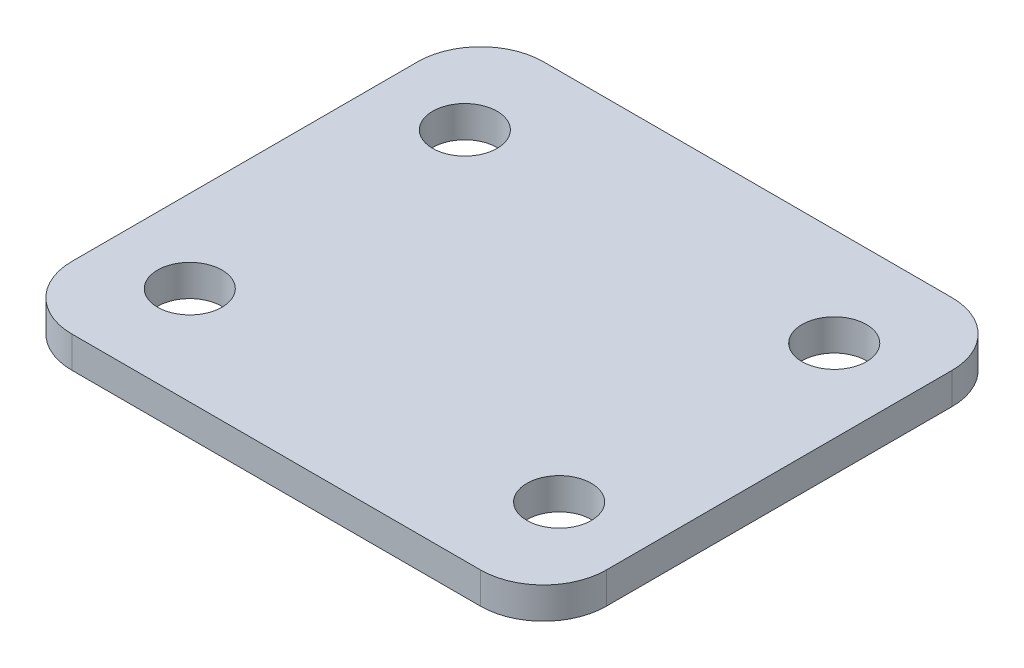
ISO-10303-21;
HEADER;
FILE_DESCRIPTION(('STEP AP214'),'2;1');
FILE_NAME('part.step','',(''),(''),'','','');
FILE_SCHEMA(('AUTOMOTIVE_DESIGN { 1 0 10303 214 1 1 1 1 }'));
ENDSEC;
DATA;
#1=APPLICATION_CONTEXT('core data for automotive mechanical design processes');
#2=APPLICATION_PROTOCOL_DEFINITION('international standard','automotive_design',2000,#1);
#3=PRODUCT_CONTEXT('',#1,'mechanical');
#4=PRODUCT('Part','Part','',(#3));
#5=PRODUCT_RELATED_PRODUCT_CATEGORY('part','',(#4));
#6=PRODUCT_DEFINITION_FORMATION('','',#4);
#7=PRODUCT_DEFINITION_CONTEXT('part definition',#1,'design');
#8=PRODUCT_DEFINITION('design','',#6,#7);
#9=PRODUCT_DEFINITION_SHAPE('','',#8);
#10=(LENGTH_UNIT() NAMED_UNIT(*) SI_UNIT(.MILLI.,.METRE.));
#11=(NAMED_UNIT(*) PLANE_ANGLE_UNIT() SI_UNIT($,.RADIAN.));
#12=(NAMED_UNIT(*) SI_UNIT($,.STERADIAN.) SOLID_ANGLE_UNIT());
#13=UNCERTAINTY_MEASURE_WITH_UNIT(LENGTH_MEASURE(1.E-05),#10,'distance_accuracy_value','');
#14=(GEOMETRIC_REPRESENTATION_CONTEXT(3) GLOBAL_UNCERTAINTY_ASSIGNED_CONTEXT((#13)) GLOBAL_UNIT_ASSIGNED_CONTEXT((#10,
#11,#12)) REPRESENTATION_CONTEXT('',''));
#15=CARTESIAN_POINT('',(0.,0.,0.));
#16=DIRECTION('',(0.,0.,1.));
#17=DIRECTION('',(1.,0.,0.));
#18=AXIS2_PLACEMENT_3D('',#15,#16,#17);
#19=CARTESIAN_POINT('',(0.,2.,0.));
#20=DIRECTION('',(0.,1.,0.));
#21=DIRECTION('',(0.,0.,1.));
#22=AXIS2_PLACEMENT_3D('',#19,#20,#21);
#23=PLANE('',#22);
#24=CARTESIAN_POINT('',(11.75,2.,8.75));
#25=DIRECTION('',(0.,1.,0.));
#26=DIRECTION('',(0.,0.,1.));
#27=AXIS2_PLACEMENT_3D('',#24,#25,#26);
#28=CIRCLE('',#27,2.05);
#29=CARTESIAN_POINT('',(11.75,2.,10.8));
#30=VERTEX_POINT('',#29);
#31=EDGE_CURVE('E192',#30,#30,#28,.T.);
#32=ORIENTED_EDGE('',*,*,#31,.F.);
#33=EDGE_LOOP('',(#32));
#34=FACE_BOUND('',#33,.T.);
#35=CARTESIAN_POINT('',(-11.75,2.,-8.75));
#36=DIRECTION('',(0.,1.,0.));
#37=DIRECTION('',(0.,0.,1.));
#38=AXIS2_PLACEMENT_3D('',#35,#36,#37);
#39=CIRCLE('',#38,2.05);
#40=CARTESIAN_POINT('',(-11.75,2.,-6.7));
#41=VERTEX_POINT('',#40);
#42=EDGE_CURVE('E182',#41,#41,#39,.T.);
#43=ORIENTED_EDGE('',*,*,#42,.F.);
#44=EDGE_LOOP('',(#43));
#45=FACE_BOUND('',#44,.T.);
#46=DIRECTION('',(-1.,0.,0.));
#47=VECTOR('',#46,1.);
#48=CARTESIAN_POINT('',(-17.,2.,-15.));
#49=LINE('',#48,#47);
#50=CARTESIAN_POINT('',(13.,2.,-15.));
#51=VERTEX_POINT('',#50);
#52=CARTESIAN_POINT('',(-13.,2.,-15.));
#53=VERTEX_POINT('',#52);
#54=EDGE_CURVE('E173',#51,#53,#49,.T.);
#55=ORIENTED_EDGE('',*,*,#54,.T.);
#56=CARTESIAN_POINT('',(-13.,2.,-11.));
#57=DIRECTION('',(0.,1.,0.));
#58=DIRECTION('',(0.,0.,1.));
#59=AXIS2_PLACEMENT_3D('',#56,#57,#58);
#60=CIRCLE('',#59,4.);
#61=CARTESIAN_POINT('',(-17.,2.,-11.));
#62=VERTEX_POINT('',#61);
#63=EDGE_CURVE('E151',#53,#62,#60,.T.);
#64=ORIENTED_EDGE('',*,*,#63,.T.);
#65=DIRECTION('',(0.,0.,1.));
#66=VECTOR('',#65,1.);
#67=CARTESIAN_POINT('',(-17.,2.,-15.));
#68=LINE('',#67,#66);
#69=CARTESIAN_POINT('',(-17.,2.,11.));
#70=VERTEX_POINT('',#69);
#71=EDGE_CURVE('E121',#62,#70,#68,.T.);
#72=ORIENTED_EDGE('',*,*,#71,.T.);
#73=CARTESIAN_POINT('',(-13.,2.,11.));
#74=DIRECTION('',(0.,1.,0.));
#75=DIRECTION('',(0.,0.,1.));
#76=AXIS2_PLACEMENT_3D('',#73,#74,#75);
#77=CIRCLE('',#76,4.);
#78=CARTESIAN_POINT('',(-13.,2.,15.));
#79=VERTEX_POINT('',#78);
#80=EDGE_CURVE('E57',#70,#79,#77,.T.);
#81=ORIENTED_EDGE('',*,*,#80,.T.);
#82=DIRECTION('',(1.,0.,0.));
#83=VECTOR('',#82,1.);
#84=CARTESIAN_POINT('',(-17.,2.,15.));
#85=LINE('',#84,#83);
#86=CARTESIAN_POINT('',(13.,2.,15.));
#87=VERTEX_POINT('',#86);
#88=EDGE_CURVE('E137',#79,#87,#85,.T.);
#89=ORIENTED_EDGE('',*,*,#88,.T.);
#90=CARTESIAN_POINT('',(13.,2.,11.));
#91=DIRECTION('',(0.,1.,0.));
#92=DIRECTION('',(0.,0.,1.));
#93=AXIS2_PLACEMENT_3D('',#90,#91,#92);
#94=CIRCLE('',#93,4.);
#95=CARTESIAN_POINT('',(17.,2.,11.));
#96=VERTEX_POINT('',#95);
#97=EDGE_CURVE('E147',#87,#96,#94,.T.);
#98=ORIENTED_EDGE('',*,*,#97,.T.);
#99=DIRECTION('',(0.,0.,-1.));
#100=VECTOR('',#99,1.);
#101=CARTESIAN_POINT('',(17.,2.,-15.));
#102=LINE('',#101,#100);
#103=CARTESIAN_POINT('',(17.,2.,-11.));
#104=VERTEX_POINT('',#103);
#105=EDGE_CURVE('E131',#96,#104,#102,.T.);
#106=ORIENTED_EDGE('',*,*,#105,.T.);
#107=CARTESIAN_POINT('',(13.,2.,-11.));
#108=DIRECTION('',(0.,1.,0.));
#109=DIRECTION('',(0.,0.,1.));
#110=AXIS2_PLACEMENT_3D('',#107,#108,#109);
#111=CIRCLE('',#110,4.);
#112=EDGE_CURVE('E149',#104,#51,#111,.T.);
#113=ORIENTED_EDGE('',*,*,#112,.T.);
#114=EDGE_LOOP('',(#55,#64,#72,#81,#89,#98,#106,#113));
#115=FACE_BOUND('',#114,.T.);
#116=CARTESIAN_POINT('',(11.75,2.,-8.75));
#117=DIRECTION('',(0.,1.,0.));
#118=DIRECTION('',(0.,0.,1.));
#119=AXIS2_PLACEMENT_3D('',#116,#117,#118);
#120=CIRCLE('',#119,2.05);
#121=CARTESIAN_POINT('',(11.75,2.,-6.7));
#122=VERTEX_POINT('',#121);
#123=EDGE_CURVE('E187',#122,#122,#120,.T.);
#124=ORIENTED_EDGE('',*,*,#123,.F.);
#125=EDGE_LOOP('',(#124));
#126=FACE_BOUND('',#125,.T.);
#127=CARTESIAN_POINT('',(-11.75,2.,8.75));
#128=DIRECTION('',(0.,1.,0.));
#129=DIRECTION('',(0.,0.,1.));
#130=AXIS2_PLACEMENT_3D('',#127,#128,#129);
#131=CIRCLE('',#130,2.05);
#132=CARTESIAN_POINT('',(-11.75,2.,10.8));
#133=VERTEX_POINT('',#132);
#134=EDGE_CURVE('E198',#133,#133,#131,.T.);
#135=ORIENTED_EDGE('',*,*,#134,.F.);
#136=EDGE_LOOP('',(#135));
#137=FACE_BOUND('',#136,.T.);
#138=ADVANCED_FACE('F37',(#34,#45,#115,#126,#137),#23,.T.);
#139=CARTESIAN_POINT('',(0.,0.,0.));
#140=DIRECTION('',(0.,1.,0.));
#141=DIRECTION('',(0.,0.,1.));
#142=AXIS2_PLACEMENT_3D('',#139,#140,#141);
#143=PLANE('',#142);
#144=DIRECTION('',(0.,0.,1.));
#145=VECTOR('',#144,1.);
#146=CARTESIAN_POINT('',(-17.,0.,-15.));
#147=LINE('',#146,#145);
#148=CARTESIAN_POINT('',(-17.,0.,-11.));
#149=VERTEX_POINT('',#148);
#150=CARTESIAN_POINT('',(-17.,0.,11.));
#151=VERTEX_POINT('',#150);
#152=EDGE_CURVE('E119',#149,#151,#147,.T.);
#153=ORIENTED_EDGE('',*,*,#152,.F.);
#154=CARTESIAN_POINT('',(-13.,0.,-11.));
#155=DIRECTION('',(0.,1.,0.));
#156=DIRECTION('',(0.,0.,1.));
#157=AXIS2_PLACEMENT_3D('',#154,#155,#156);
#158=CIRCLE('',#157,4.);
#159=CARTESIAN_POINT('',(-13.,0.,-15.));
#160=VERTEX_POINT('',#159);
#161=EDGE_CURVE('E102',#149,#160,#158,.F.);
#162=ORIENTED_EDGE('',*,*,#161,.T.);
#163=DIRECTION('',(-1.,0.,0.));
#164=VECTOR('',#163,1.);
#165=CARTESIAN_POINT('',(-17.,0.,-15.));
#166=LINE('',#165,#164);
#167=CARTESIAN_POINT('',(13.,0.,-15.));
#168=VERTEX_POINT('',#167);
#169=EDGE_CURVE('E129',#168,#160,#166,.T.);
#170=ORIENTED_EDGE('',*,*,#169,.F.);
#171=CARTESIAN_POINT('',(13.,0.,-11.));
#172=DIRECTION('',(0.,1.,0.));
#173=DIRECTION('',(0.,0.,1.));
#174=AXIS2_PLACEMENT_3D('',#171,#172,#173);
#175=CIRCLE('',#174,4.);
#176=CARTESIAN_POINT('',(17.,0.,-11.));
#177=VERTEX_POINT('',#176);
#178=EDGE_CURVE('E113',#168,#177,#175,.F.);
#179=ORIENTED_EDGE('',*,*,#178,.T.);
#180=DIRECTION('',(0.,0.,-1.));
#181=VECTOR('',#180,1.);
#182=CARTESIAN_POINT('',(17.,0.,-15.));
#183=LINE('',#182,#181);
#184=CARTESIAN_POINT('',(17.,0.,11.));
#185=VERTEX_POINT('',#184);
#186=EDGE_CURVE('E133',#185,#177,#183,.T.);
#187=ORIENTED_EDGE('',*,*,#186,.F.);
#188=CARTESIAN_POINT('',(13.,0.,11.));
#189=DIRECTION('',(0.,1.,0.));
#190=DIRECTION('',(0.,0.,1.));
#191=AXIS2_PLACEMENT_3D('',#188,#189,#190);
#192=CIRCLE('',#191,4.);
#193=CARTESIAN_POINT('',(13.,0.,15.));
#194=VERTEX_POINT('',#193);
#195=EDGE_CURVE('E140',#185,#194,#192,.F.);
#196=ORIENTED_EDGE('',*,*,#195,.T.);
#197=DIRECTION('',(1.,0.,0.));
#198=VECTOR('',#197,1.);
#199=CARTESIAN_POINT('',(-17.,0.,15.));
#200=LINE('',#199,#198);
#201=CARTESIAN_POINT('',(-13.,0.,15.));
#202=VERTEX_POINT('',#201);
#203=EDGE_CURVE('E128',#202,#194,#200,.T.);
#204=ORIENTED_EDGE('',*,*,#203,.F.);
#205=CARTESIAN_POINT('',(-13.,0.,11.));
#206=DIRECTION('',(0.,1.,0.));
#207=DIRECTION('',(0.,0.,1.));
#208=AXIS2_PLACEMENT_3D('',#205,#206,#207);
#209=CIRCLE('',#208,4.);
#210=EDGE_CURVE('E122',#202,#151,#209,.F.);
#211=ORIENTED_EDGE('',*,*,#210,.T.);
#212=EDGE_LOOP('',(#153,#162,#170,#179,#187,#196,#204,#211));
#213=FACE_BOUND('',#212,.T.);
#214=CARTESIAN_POINT('',(-11.75,0.,-8.75));
#215=DIRECTION('',(0.,1.,0.));
#216=DIRECTION('',(0.,0.,1.));
#217=AXIS2_PLACEMENT_3D('',#214,#215,#216);
#218=CIRCLE('',#217,2.05);
#219=CARTESIAN_POINT('',(-11.75,0.,-6.7));
#220=VERTEX_POINT('',#219);
#221=EDGE_CURVE('E178',#220,#220,#218,.T.);
#222=ORIENTED_EDGE('',*,*,#221,.T.);
#223=EDGE_LOOP('',(#222));
#224=FACE_BOUND('',#223,.T.);
#225=CARTESIAN_POINT('',(11.75,0.,-8.75));
#226=DIRECTION('',(0.,1.,0.));
#227=DIRECTION('',(0.,0.,1.));
#228=AXIS2_PLACEMENT_3D('',#225,#226,#227);
#229=CIRCLE('',#228,2.05);
#230=CARTESIAN_POINT('',(11.75,0.,-6.7));
#231=VERTEX_POINT('',#230);
#232=EDGE_CURVE('E189',#231,#231,#229,.T.);
#233=ORIENTED_EDGE('',*,*,#232,.T.);
#234=EDGE_LOOP('',(#233));
#235=FACE_BOUND('',#234,.T.);
#236=CARTESIAN_POINT('',(11.75,0.,8.75));
#237=DIRECTION('',(0.,1.,0.));
#238=DIRECTION('',(0.,0.,1.));
#239=AXIS2_PLACEMENT_3D('',#236,#237,#238);
#240=CIRCLE('',#239,2.05);
#241=CARTESIAN_POINT('',(11.75,0.,10.8));
#242=VERTEX_POINT('',#241);
#243=EDGE_CURVE('E195',#242,#242,#240,.T.);
#244=ORIENTED_EDGE('',*,*,#243,.T.);
#245=EDGE_LOOP('',(#244));
#246=FACE_BOUND('',#245,.T.);
#247=CARTESIAN_POINT('',(-11.75,0.,8.75));
#248=DIRECTION('',(0.,1.,0.));
#249=DIRECTION('',(0.,0.,1.));
#250=AXIS2_PLACEMENT_3D('',#247,#248,#249);
#251=CIRCLE('',#250,2.05);
#252=CARTESIAN_POINT('',(-11.75,0.,10.8));
#253=VERTEX_POINT('',#252);
#254=EDGE_CURVE('E201',#253,#253,#251,.T.);
#255=ORIENTED_EDGE('',*,*,#254,.T.);
#256=EDGE_LOOP('',(#255));
#257=FACE_BOUND('',#256,.T.);
#258=ADVANCED_FACE('F125',(#213,#224,#235,#246,#257),#143,.F.);
#259=CARTESIAN_POINT('',(17.,2.,-15.));
#260=DIRECTION('',(-1.,0.,0.));
#261=DIRECTION('',(0.,0.,1.));
#262=AXIS2_PLACEMENT_3D('',#259,#260,#261);
#263=PLANE('',#262);
#264=ORIENTED_EDGE('',*,*,#186,.T.);
#265=DIRECTION('',(0.,-1.,0.));
#266=VECTOR('',#265,1.);
#267=CARTESIAN_POINT('',(17.,2.,-11.));
#268=LINE('',#267,#266);
#269=EDGE_CURVE('E156',#177,#104,#268,.F.);
#270=ORIENTED_EDGE('',*,*,#269,.T.);
#271=ORIENTED_EDGE('',*,*,#105,.F.);
#272=DIRECTION('',(0.,-1.,0.));
#273=VECTOR('',#272,1.);
#274=CARTESIAN_POINT('',(17.,2.,11.));
#275=LINE('',#274,#273);
#276=EDGE_CURVE('E153',#96,#185,#275,.T.);
#277=ORIENTED_EDGE('',*,*,#276,.T.);
#278=EDGE_LOOP('',(#264,#270,#271,#277));
#279=FACE_BOUND('',#278,.T.);
#280=ADVANCED_FACE('F169',(#279),#263,.F.);
#281=CARTESIAN_POINT('',(-17.,2.,-15.));
#282=DIRECTION('',(0.,0.,1.));
#283=DIRECTION('',(1.,0.,0.));
#284=AXIS2_PLACEMENT_3D('',#281,#282,#283);
#285=PLANE('',#284);
#286=ORIENTED_EDGE('',*,*,#169,.T.);
#287=DIRECTION('',(0.,-1.,0.));
#288=VECTOR('',#287,1.);
#289=CARTESIAN_POINT('',(-13.,2.,-15.));
#290=LINE('',#289,#288);
#291=EDGE_CURVE('E107',#160,#53,#290,.F.);
#292=ORIENTED_EDGE('',*,*,#291,.T.);
#293=ORIENTED_EDGE('',*,*,#54,.F.);
#294=DIRECTION('',(0.,-1.,0.));
#295=VECTOR('',#294,1.);
#296=CARTESIAN_POINT('',(13.,2.,-15.));
#297=LINE('',#296,#295);
#298=EDGE_CURVE('E112',#51,#168,#297,.T.);
#299=ORIENTED_EDGE('',*,*,#298,.T.);
#300=EDGE_LOOP('',(#286,#292,#293,#299));
#301=FACE_BOUND('',#300,.T.);
#302=ADVANCED_FACE('F227',(#301),#285,.F.);
#303=CARTESIAN_POINT('',(-17.,2.,-15.));
#304=DIRECTION('',(1.,0.,0.));
#305=DIRECTION('',(0.,0.,-1.));
#306=AXIS2_PLACEMENT_3D('',#303,#304,#305);
#307=PLANE('',#306);
#308=ORIENTED_EDGE('',*,*,#71,.F.);
#309=DIRECTION('',(0.,-1.,0.));
#310=VECTOR('',#309,1.);
#311=CARTESIAN_POINT('',(-17.,2.,-11.));
#312=LINE('',#311,#310);
#313=EDGE_CURVE('E106',#62,#149,#312,.T.);
#314=ORIENTED_EDGE('',*,*,#313,.T.);
#315=ORIENTED_EDGE('',*,*,#152,.T.);
#316=DIRECTION('',(0.,-1.,0.));
#317=VECTOR('',#316,1.);
#318=CARTESIAN_POINT('',(-17.,2.,11.));
#319=LINE('',#318,#317);
#320=EDGE_CURVE('E123',#151,#70,#319,.F.);
#321=ORIENTED_EDGE('',*,*,#320,.T.);
#322=EDGE_LOOP('',(#308,#314,#315,#321));
#323=FACE_BOUND('',#322,.T.);
#324=ADVANCED_FACE('F118',(#323),#307,.F.);
#325=CARTESIAN_POINT('',(-17.,2.,15.));
#326=DIRECTION('',(0.,0.,-1.));
#327=DIRECTION('',(-1.,0.,0.));
#328=AXIS2_PLACEMENT_3D('',#325,#326,#327);
#329=PLANE('',#328);
#330=ORIENTED_EDGE('',*,*,#203,.T.);
#331=DIRECTION('',(0.,-1.,0.));
#332=VECTOR('',#331,1.);
#333=CARTESIAN_POINT('',(13.,2.,15.));
#334=LINE('',#333,#332);
#335=EDGE_CURVE('E11',#194,#87,#334,.F.);
#336=ORIENTED_EDGE('',*,*,#335,.T.);
#337=ORIENTED_EDGE('',*,*,#88,.F.);
#338=DIRECTION('',(0.,-1.,0.));
#339=VECTOR('',#338,1.);
#340=CARTESIAN_POINT('',(-13.,2.,15.));
#341=LINE('',#340,#339);
#342=EDGE_CURVE('E45',#79,#202,#341,.T.);
#343=ORIENTED_EDGE('',*,*,#342,.T.);
#344=EDGE_LOOP('',(#330,#336,#337,#343));
#345=FACE_BOUND('',#344,.T.);
#346=ADVANCED_FACE('F159',(#345),#329,.F.);
#347=CARTESIAN_POINT('',(-11.75,2.,-8.75));
#348=DIRECTION('',(0.,-1.,0.));
#349=DIRECTION('',(0.,0.,-1.));
#350=AXIS2_PLACEMENT_3D('',#347,#348,#349);
#351=CYLINDRICAL_SURFACE('',#350,2.05);
#352=ORIENTED_EDGE('',*,*,#42,.T.);
#353=EDGE_LOOP('',(#352));
#354=FACE_BOUND('',#353,.T.);
#355=ORIENTED_EDGE('',*,*,#221,.F.);
#356=EDGE_LOOP('',(#355));
#357=FACE_BOUND('',#356,.T.);
#358=ADVANCED_FACE('F220',(#354,#357),#351,.F.);
#359=CARTESIAN_POINT('',(11.75,2.,-8.75));
#360=DIRECTION('',(0.,-1.,0.));
#361=DIRECTION('',(0.,0.,-1.));
#362=AXIS2_PLACEMENT_3D('',#359,#360,#361);
#363=CYLINDRICAL_SURFACE('',#362,2.05);
#364=ORIENTED_EDGE('',*,*,#123,.T.);
#365=EDGE_LOOP('',(#364));
#366=FACE_BOUND('',#365,.T.);
#367=ORIENTED_EDGE('',*,*,#232,.F.);
#368=EDGE_LOOP('',(#367));
#369=FACE_BOUND('',#368,.T.);
#370=ADVANCED_FACE('F249',(#366,#369),#363,.F.);
#371=CARTESIAN_POINT('',(11.75,2.,8.75));
#372=DIRECTION('',(0.,-1.,0.));
#373=DIRECTION('',(0.,0.,-1.));
#374=AXIS2_PLACEMENT_3D('',#371,#372,#373);
#375=CYLINDRICAL_SURFACE('',#374,2.05);
#376=ORIENTED_EDGE('',*,*,#31,.T.);
#377=EDGE_LOOP('',(#376));
#378=FACE_BOUND('',#377,.T.);
#379=ORIENTED_EDGE('',*,*,#243,.F.);
#380=EDGE_LOOP('',(#379));
#381=FACE_BOUND('',#380,.T.);
#382=ADVANCED_FACE('F252',(#378,#381),#375,.F.);
#383=CARTESIAN_POINT('',(-11.75,2.,8.75));
#384=DIRECTION('',(0.,-1.,0.));
#385=DIRECTION('',(0.,0.,-1.));
#386=AXIS2_PLACEMENT_3D('',#383,#384,#385);
#387=CYLINDRICAL_SURFACE('',#386,2.05);
#388=ORIENTED_EDGE('',*,*,#134,.T.);
#389=EDGE_LOOP('',(#388));
#390=FACE_BOUND('',#389,.T.);
#391=ORIENTED_EDGE('',*,*,#254,.F.);
#392=EDGE_LOOP('',(#391));
#393=FACE_BOUND('',#392,.T.);
#394=ADVANCED_FACE('F207',(#390,#393),#387,.F.);
#395=CARTESIAN_POINT('',(-13.,2.,-11.));
#396=DIRECTION('',(0.,-1.,0.));
#397=DIRECTION('',(0.,0.,-1.));
#398=AXIS2_PLACEMENT_3D('',#395,#396,#397);
#399=CYLINDRICAL_SURFACE('',#398,4.);
#400=ORIENTED_EDGE('',*,*,#63,.F.);
#401=ORIENTED_EDGE('',*,*,#291,.F.);
#402=ORIENTED_EDGE('',*,*,#161,.F.);
#403=ORIENTED_EDGE('',*,*,#313,.F.);
#404=EDGE_LOOP('',(#400,#401,#402,#403));
#405=FACE_BOUND('',#404,.T.);
#406=ADVANCED_FACE('F105',(#405),#399,.T.);
#407=CARTESIAN_POINT('',(13.,2.,-11.));
#408=DIRECTION('',(0.,-1.,0.));
#409=DIRECTION('',(0.,0.,-1.));
#410=AXIS2_PLACEMENT_3D('',#407,#408,#409);
#411=CYLINDRICAL_SURFACE('',#410,4.);
#412=ORIENTED_EDGE('',*,*,#112,.F.);
#413=ORIENTED_EDGE('',*,*,#269,.F.);
#414=ORIENTED_EDGE('',*,*,#178,.F.);
#415=ORIENTED_EDGE('',*,*,#298,.F.);
#416=EDGE_LOOP('',(#412,#413,#414,#415));
#417=FACE_BOUND('',#416,.T.);
#418=ADVANCED_FACE('F235',(#417),#411,.T.);
#419=CARTESIAN_POINT('',(13.,2.,11.));
#420=DIRECTION('',(0.,-1.,0.));
#421=DIRECTION('',(0.,0.,-1.));
#422=AXIS2_PLACEMENT_3D('',#419,#420,#421);
#423=CYLINDRICAL_SURFACE('',#422,4.);
#424=ORIENTED_EDGE('',*,*,#97,.F.);
#425=ORIENTED_EDGE('',*,*,#335,.F.);
#426=ORIENTED_EDGE('',*,*,#195,.F.);
#427=ORIENTED_EDGE('',*,*,#276,.F.);
#428=EDGE_LOOP('',(#424,#425,#426,#427));
#429=FACE_BOUND('',#428,.T.);
#430=ADVANCED_FACE('F166',(#429),#423,.T.);
#431=CARTESIAN_POINT('',(-13.,2.,11.));
#432=DIRECTION('',(0.,-1.,0.));
#433=DIRECTION('',(0.,0.,-1.));
#434=AXIS2_PLACEMENT_3D('',#431,#432,#433);
#435=CYLINDRICAL_SURFACE('',#434,4.);
#436=ORIENTED_EDGE('',*,*,#80,.F.);
#437=ORIENTED_EDGE('',*,*,#320,.F.);
#438=ORIENTED_EDGE('',*,*,#210,.F.);
#439=ORIENTED_EDGE('',*,*,#342,.F.);
#440=EDGE_LOOP('',(#436,#437,#438,#439));
#441=FACE_BOUND('',#440,.T.);
#442=ADVANCED_FACE('F39',(#441),#435,.T.);
#443=CLOSED_SHELL('',(#138,#258,#280,#302,#324,#346,#358,#370,#382,#394,#406,#418,#430,#442));
#444=MANIFOLD_SOLID_BREP('B2',#443);
#445=ADVANCED_BREP_SHAPE_REPRESENTATION('',(#18,#444),#14);
#446=SHAPE_DEFINITION_REPRESENTATION(#9,#445);
ENDSEC;
END-ISO-10303-21;
